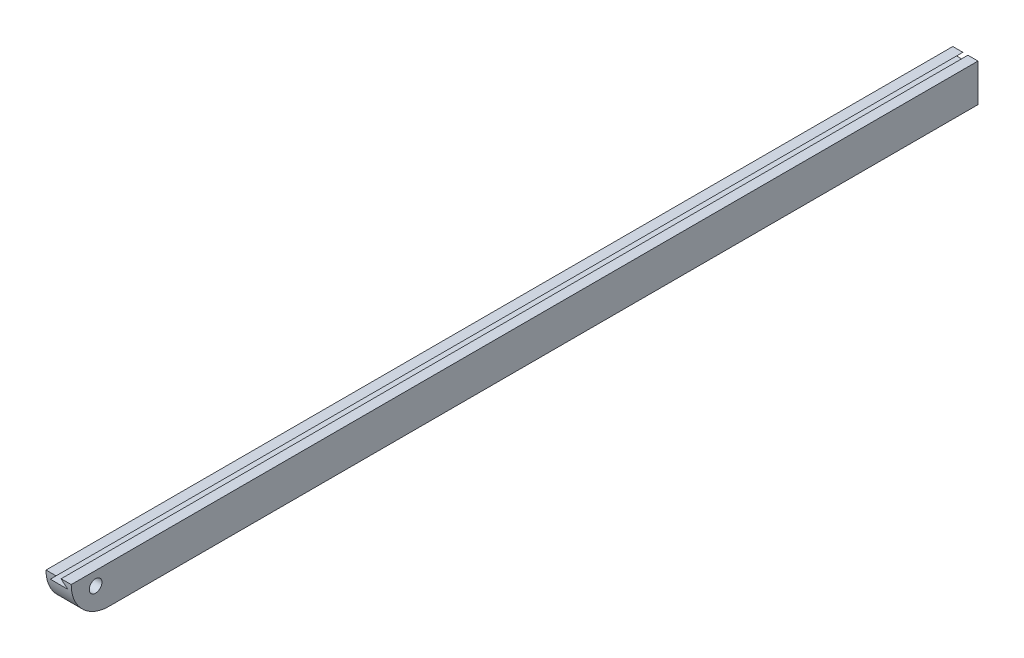
ISO-10303-21;
HEADER;
FILE_DESCRIPTION(('STEP AP214'),'2;1');
FILE_NAME('part.step','',(''),(''),'','','');
FILE_SCHEMA(('AUTOMOTIVE_DESIGN { 1 0 10303 214 1 1 1 1 }'));
ENDSEC;
DATA;
#1=APPLICATION_CONTEXT('core data for automotive mechanical design processes');
#2=APPLICATION_PROTOCOL_DEFINITION('international standard','automotive_design',2000,#1);
#3=PRODUCT_CONTEXT('',#1,'mechanical');
#4=PRODUCT('Part','Part','',(#3));
#5=PRODUCT_RELATED_PRODUCT_CATEGORY('part','',(#4));
#6=PRODUCT_DEFINITION_FORMATION('','',#4);
#7=PRODUCT_DEFINITION_CONTEXT('part definition',#1,'design');
#8=PRODUCT_DEFINITION('design','',#6,#7);
#9=PRODUCT_DEFINITION_SHAPE('','',#8);
#10=(LENGTH_UNIT() NAMED_UNIT(*) SI_UNIT(.MILLI.,.METRE.));
#11=(NAMED_UNIT(*) PLANE_ANGLE_UNIT() SI_UNIT($,.RADIAN.));
#12=(NAMED_UNIT(*) SI_UNIT($,.STERADIAN.) SOLID_ANGLE_UNIT());
#13=UNCERTAINTY_MEASURE_WITH_UNIT(LENGTH_MEASURE(1.E-05),#10,'distance_accuracy_value','');
#14=(GEOMETRIC_REPRESENTATION_CONTEXT(3) GLOBAL_UNCERTAINTY_ASSIGNED_CONTEXT((#13)) GLOBAL_UNIT_ASSIGNED_CONTEXT((#10,
#11,#12)) REPRESENTATION_CONTEXT('',''));
#15=CARTESIAN_POINT('',(0.,0.,0.));
#16=DIRECTION('',(0.,0.,1.));
#17=DIRECTION('',(1.,0.,0.));
#18=AXIS2_PLACEMENT_3D('',#15,#16,#17);
#19=CARTESIAN_POINT('',(0.,0.,457.2));
#20=DIRECTION('',(1.,0.,0.));
#21=DIRECTION('',(0.,1.,0.));
#22=AXIS2_PLACEMENT_3D('',#19,#20,#21);
#23=PLANE('',#22);
#24=CARTESIAN_POINT('',(0.,-6.73519209080186,444.885192090802));
#25=DIRECTION('',(1.,0.,0.));
#26=DIRECTION('',(0.,1.,0.));
#27=AXIS2_PLACEMENT_3D('',#24,#25,#26);
#28=CIRCLE('',#27,3.17499999999997);
#29=CARTESIAN_POINT('',(0.,-3.56019209080189,444.885192090802));
#30=VERTEX_POINT('',#29);
#31=EDGE_CURVE('E177',#30,#30,#28,.T.);
#32=ORIENTED_EDGE('',*,*,#31,.T.);
#33=EDGE_LOOP('',(#32));
#34=FACE_BOUND('',#33,.T.);
#35=DIRECTION('',(0.,0.,-1.));
#36=VECTOR('',#35,1.);
#37=CARTESIAN_POINT('',(0.,-19.05,457.2));
#38=LINE('',#37,#36);
#39=CARTESIAN_POINT('',(0.,-19.05,438.15));
#40=VERTEX_POINT('',#39);
#41=CARTESIAN_POINT('',(0.,-19.05,0.));
#42=VERTEX_POINT('',#41);
#43=EDGE_CURVE('E11',#40,#42,#38,.T.);
#44=ORIENTED_EDGE('',*,*,#43,.F.);
#45=CARTESIAN_POINT('',(0.,0.,438.15));
#46=DIRECTION('',(-1.,0.,0.));
#47=DIRECTION('',(0.,1.,0.));
#48=AXIS2_PLACEMENT_3D('',#45,#46,#47);
#49=CIRCLE('',#48,19.05);
#50=CARTESIAN_POINT('',(0.,0.,457.2));
#51=VERTEX_POINT('',#50);
#52=EDGE_CURVE('E171',#40,#51,#49,.T.);
#53=ORIENTED_EDGE('',*,*,#52,.T.);
#54=DIRECTION('',(0.,0.,-1.));
#55=VECTOR('',#54,1.);
#56=CARTESIAN_POINT('',(0.,0.,457.2));
#57=LINE('',#56,#55);
#58=CARTESIAN_POINT('',(0.,0.,0.));
#59=VERTEX_POINT('',#58);
#60=EDGE_CURVE('E96',#51,#59,#57,.T.);
#61=ORIENTED_EDGE('',*,*,#60,.T.);
#62=DIRECTION('',(0.,-1.,0.));
#63=VECTOR('',#62,1.);
#64=CARTESIAN_POINT('',(0.,0.,0.));
#65=LINE('',#64,#63);
#66=EDGE_CURVE('E102',#59,#42,#65,.T.);
#67=ORIENTED_EDGE('',*,*,#66,.T.);
#68=EDGE_LOOP('',(#44,#53,#61,#67));
#69=FACE_BOUND('',#68,.T.);
#70=ADVANCED_FACE('F35',(#34,#69),#23,.F.);
#71=CARTESIAN_POINT('',(0.,-19.05,457.2));
#72=DIRECTION('',(0.,1.,0.));
#73=DIRECTION('',(0.,0.,1.));
#74=AXIS2_PLACEMENT_3D('',#71,#72,#73);
#75=PLANE('',#74);
#76=DIRECTION('',(0.,0.,-1.));
#77=VECTOR('',#76,1.);
#78=CARTESIAN_POINT('',(12.7,-19.05,457.2));
#79=LINE('',#78,#77);
#80=CARTESIAN_POINT('',(12.7,-19.05,438.15));
#81=VERTEX_POINT('',#80);
#82=CARTESIAN_POINT('',(12.7,-19.05,0.));
#83=VERTEX_POINT('',#82);
#84=EDGE_CURVE('E43',#81,#83,#79,.T.);
#85=ORIENTED_EDGE('',*,*,#84,.F.);
#86=DIRECTION('',(1.,0.,0.));
#87=VECTOR('',#86,1.);
#88=CARTESIAN_POINT('',(0.,-19.05,438.15));
#89=LINE('',#88,#87);
#90=EDGE_CURVE('E174',#40,#81,#89,.T.);
#91=ORIENTED_EDGE('',*,*,#90,.F.);
#92=ORIENTED_EDGE('',*,*,#43,.T.);
#93=DIRECTION('',(1.,0.,0.));
#94=VECTOR('',#93,1.);
#95=CARTESIAN_POINT('',(0.,-19.05,0.));
#96=LINE('',#95,#94);
#97=EDGE_CURVE('E131',#42,#83,#96,.T.);
#98=ORIENTED_EDGE('',*,*,#97,.T.);
#99=EDGE_LOOP('',(#85,#91,#92,#98));
#100=FACE_BOUND('',#99,.T.);
#101=ADVANCED_FACE('F132',(#100),#75,.F.);
#102=CARTESIAN_POINT('',(12.7,0.,457.2));
#103=DIRECTION('',(-1.,0.,0.));
#104=DIRECTION('',(0.,-1.,0.));
#105=AXIS2_PLACEMENT_3D('',#102,#103,#104);
#106=PLANE('',#105);
#107=CARTESIAN_POINT('',(12.7,-6.73519209080186,444.885192090802));
#108=DIRECTION('',(1.,0.,0.));
#109=DIRECTION('',(0.,1.,0.));
#110=AXIS2_PLACEMENT_3D('',#107,#108,#109);
#111=CIRCLE('',#110,3.17499999999997);
#112=CARTESIAN_POINT('',(12.7,-3.56019209080189,444.885192090802));
#113=VERTEX_POINT('',#112);
#114=EDGE_CURVE('E180',#113,#113,#111,.T.);
#115=ORIENTED_EDGE('',*,*,#114,.F.);
#116=EDGE_LOOP('',(#115));
#117=FACE_BOUND('',#116,.T.);
#118=DIRECTION('',(0.,0.,-1.));
#119=VECTOR('',#118,1.);
#120=CARTESIAN_POINT('',(12.7,0.,457.2));
#121=LINE('',#120,#119);
#122=CARTESIAN_POINT('',(12.7,0.,457.2));
#123=VERTEX_POINT('',#122);
#124=CARTESIAN_POINT('',(12.7,0.,0.));
#125=VERTEX_POINT('',#124);
#126=EDGE_CURVE('E116',#123,#125,#121,.T.);
#127=ORIENTED_EDGE('',*,*,#126,.F.);
#128=CARTESIAN_POINT('',(12.7,0.,438.15));
#129=DIRECTION('',(-1.,0.,0.));
#130=DIRECTION('',(0.,1.,0.));
#131=AXIS2_PLACEMENT_3D('',#128,#129,#130);
#132=CIRCLE('',#131,19.05);
#133=EDGE_CURVE('E128',#81,#123,#132,.T.);
#134=ORIENTED_EDGE('',*,*,#133,.F.);
#135=ORIENTED_EDGE('',*,*,#84,.T.);
#136=DIRECTION('',(0.,1.,0.));
#137=VECTOR('',#136,1.);
#138=CARTESIAN_POINT('',(12.7,0.,0.));
#139=LINE('',#138,#137);
#140=EDGE_CURVE('E125',#83,#125,#139,.T.);
#141=ORIENTED_EDGE('',*,*,#140,.T.);
#142=EDGE_LOOP('',(#127,#134,#135,#141));
#143=FACE_BOUND('',#142,.T.);
#144=ADVANCED_FACE('F123',(#117,#143),#106,.F.);
#145=CARTESIAN_POINT('',(7.61999999999996,0.,457.2));
#146=DIRECTION('',(0.,-1.,0.));
#147=DIRECTION('',(1.,0.,0.));
#148=AXIS2_PLACEMENT_3D('',#145,#146,#147);
#149=PLANE('',#148);
#150=DIRECTION('',(-1.,0.,0.));
#151=VECTOR('',#150,1.);
#152=CARTESIAN_POINT('',(7.61999999999996,0.,0.));
#153=LINE('',#152,#151);
#154=CARTESIAN_POINT('',(7.61999999999996,0.,0.));
#155=VERTEX_POINT('',#154);
#156=EDGE_CURVE('E137',#125,#155,#153,.T.);
#157=ORIENTED_EDGE('',*,*,#156,.T.);
#158=DIRECTION('',(0.,0.,-1.));
#159=VECTOR('',#158,1.);
#160=CARTESIAN_POINT('',(7.61999999999996,0.,457.2));
#161=LINE('',#160,#159);
#162=CARTESIAN_POINT('',(7.61999999999996,0.,457.2));
#163=VERTEX_POINT('',#162);
#164=EDGE_CURVE('E113',#163,#155,#161,.T.);
#165=ORIENTED_EDGE('',*,*,#164,.F.);
#166=DIRECTION('',(-1.,0.,0.));
#167=VECTOR('',#166,1.);
#168=CARTESIAN_POINT('',(7.61999999999996,0.,457.2));
#169=LINE('',#168,#167);
#170=EDGE_CURVE('E103',#123,#163,#169,.T.);
#171=ORIENTED_EDGE('',*,*,#170,.F.);
#172=ORIENTED_EDGE('',*,*,#126,.T.);
#173=EDGE_LOOP('',(#157,#165,#171,#172));
#174=FACE_BOUND('',#173,.T.);
#175=ADVANCED_FACE('F158',(#174),#149,.F.);
#176=CARTESIAN_POINT('',(10.795,-3.175,457.2));
#177=DIRECTION('',(0.707106781186544,0.707106781186551,0.));
#178=DIRECTION('',(-0.707106781186551,0.707106781186544,0.));
#179=AXIS2_PLACEMENT_3D('',#176,#177,#178);
#180=PLANE('',#179);
#181=DIRECTION('',(0.,0.,-1.));
#182=VECTOR('',#181,1.);
#183=CARTESIAN_POINT('',(10.795,-3.175,457.2));
#184=LINE('',#183,#182);
#185=CARTESIAN_POINT('',(10.795,-3.175,456.933553311341));
#186=VERTEX_POINT('',#185);
#187=CARTESIAN_POINT('',(10.795,-3.175,0.));
#188=VERTEX_POINT('',#187);
#189=EDGE_CURVE('E111',#186,#188,#184,.T.);
#190=ORIENTED_EDGE('',*,*,#189,.F.);
#191=CARTESIAN_POINT('',(7.61999999999996,0.,438.15));
#192=DIRECTION('',(0.707106781186544,0.707106781186551,0.));
#193=DIRECTION('',(0.707106781186551,-0.707106781186544,0.));
#194=AXIS2_PLACEMENT_3D('',#191,#192,#193);
#195=ELLIPSE('',#194,26.9407683632076,19.05);
#196=EDGE_CURVE('E155',#186,#163,#195,.F.);
#197=ORIENTED_EDGE('',*,*,#196,.T.);
#198=ORIENTED_EDGE('',*,*,#164,.T.);
#199=DIRECTION('',(0.707106781186551,-0.707106781186544,0.));
#200=VECTOR('',#199,1.);
#201=CARTESIAN_POINT('',(10.795,-3.175,0.));
#202=LINE('',#201,#200);
#203=EDGE_CURVE('E139',#155,#188,#202,.T.);
#204=ORIENTED_EDGE('',*,*,#203,.T.);
#205=EDGE_LOOP('',(#190,#197,#198,#204));
#206=FACE_BOUND('',#205,.T.);
#207=ADVANCED_FACE('F150',(#206),#180,.F.);
#208=CARTESIAN_POINT('',(1.905,-3.175,457.2));
#209=DIRECTION('',(0.,-1.,0.));
#210=DIRECTION('',(0.,0.,-1.));
#211=AXIS2_PLACEMENT_3D('',#208,#209,#210);
#212=PLANE('',#211);
#213=DIRECTION('',(0.,0.,-1.));
#214=VECTOR('',#213,1.);
#215=CARTESIAN_POINT('',(1.905,-3.175,457.2));
#216=LINE('',#215,#214);
#217=CARTESIAN_POINT('',(1.905,-3.175,456.933553311341));
#218=VERTEX_POINT('',#217);
#219=CARTESIAN_POINT('',(1.905,-3.175,0.));
#220=VERTEX_POINT('',#219);
#221=EDGE_CURVE('E83',#218,#220,#216,.T.);
#222=ORIENTED_EDGE('',*,*,#221,.F.);
#223=DIRECTION('',(1.,0.,0.));
#224=VECTOR('',#223,1.);
#225=CARTESIAN_POINT('',(0.,-3.175,456.933553311341));
#226=LINE('',#225,#224);
#227=EDGE_CURVE('E184',#218,#186,#226,.T.);
#228=ORIENTED_EDGE('',*,*,#227,.T.);
#229=ORIENTED_EDGE('',*,*,#189,.T.);
#230=DIRECTION('',(-1.,0.,0.));
#231=VECTOR('',#230,1.);
#232=CARTESIAN_POINT('',(1.905,-3.175,0.));
#233=LINE('',#232,#231);
#234=EDGE_CURVE('E89',#188,#220,#233,.T.);
#235=ORIENTED_EDGE('',*,*,#234,.T.);
#236=EDGE_LOOP('',(#222,#228,#229,#235));
#237=FACE_BOUND('',#236,.T.);
#238=ADVANCED_FACE('F145',(#237),#212,.F.);
#239=CARTESIAN_POINT('',(5.08000000000003,0.,457.2));
#240=DIRECTION('',(-0.707106781186544,0.707106781186551,0.));
#241=DIRECTION('',(-0.707106781186551,-0.707106781186544,0.));
#242=AXIS2_PLACEMENT_3D('',#239,#240,#241);
#243=PLANE('',#242);
#244=DIRECTION('',(0.,0.,-1.));
#245=VECTOR('',#244,1.);
#246=CARTESIAN_POINT('',(5.08000000000003,0.,457.2));
#247=LINE('',#246,#245);
#248=CARTESIAN_POINT('',(5.08000000000003,0.,457.2));
#249=VERTEX_POINT('',#248);
#250=CARTESIAN_POINT('',(5.08000000000003,0.,0.));
#251=VERTEX_POINT('',#250);
#252=EDGE_CURVE('E80',#249,#251,#247,.T.);
#253=ORIENTED_EDGE('',*,*,#252,.F.);
#254=CARTESIAN_POINT('',(5.08000000000003,0.,438.15));
#255=DIRECTION('',(-0.707106781186544,0.707106781186551,0.));
#256=DIRECTION('',(0.707106781186551,0.707106781186544,0.));
#257=AXIS2_PLACEMENT_3D('',#254,#255,#256);
#258=ELLIPSE('',#257,26.9407683632076,19.05);
#259=EDGE_CURVE('E50',#249,#218,#258,.F.);
#260=ORIENTED_EDGE('',*,*,#259,.T.);
#261=ORIENTED_EDGE('',*,*,#221,.T.);
#262=DIRECTION('',(0.707106781186551,0.707106781186544,0.));
#263=VECTOR('',#262,1.);
#264=CARTESIAN_POINT('',(5.08000000000003,0.,0.));
#265=LINE('',#264,#263);
#266=EDGE_CURVE('E77',#220,#251,#265,.T.);
#267=ORIENTED_EDGE('',*,*,#266,.T.);
#268=EDGE_LOOP('',(#253,#260,#261,#267));
#269=FACE_BOUND('',#268,.T.);
#270=ADVANCED_FACE('F79',(#269),#243,.F.);
#271=CARTESIAN_POINT('',(0.,0.,457.2));
#272=DIRECTION('',(0.,-1.,0.));
#273=DIRECTION('',(0.,0.,-1.));
#274=AXIS2_PLACEMENT_3D('',#271,#272,#273);
#275=PLANE('',#274);
#276=DIRECTION('',(-1.,0.,0.));
#277=VECTOR('',#276,1.);
#278=CARTESIAN_POINT('',(0.,0.,0.));
#279=LINE('',#278,#277);
#280=EDGE_CURVE('E88',#251,#59,#279,.T.);
#281=ORIENTED_EDGE('',*,*,#280,.T.);
#282=ORIENTED_EDGE('',*,*,#60,.F.);
#283=DIRECTION('',(-1.,0.,0.));
#284=VECTOR('',#283,1.);
#285=CARTESIAN_POINT('',(0.,0.,457.2));
#286=LINE('',#285,#284);
#287=EDGE_CURVE('E95',#249,#51,#286,.T.);
#288=ORIENTED_EDGE('',*,*,#287,.F.);
#289=ORIENTED_EDGE('',*,*,#252,.T.);
#290=EDGE_LOOP('',(#281,#282,#288,#289));
#291=FACE_BOUND('',#290,.T.);
#292=ADVANCED_FACE('F92',(#291),#275,.F.);
#293=CARTESIAN_POINT('',(0.,0.,0.));
#294=DIRECTION('',(0.,0.,1.));
#295=DIRECTION('',(1.,0.,0.));
#296=AXIS2_PLACEMENT_3D('',#293,#294,#295);
#297=PLANE('',#296);
#298=CARTESIAN_POINT('',(6.35,-11.43,0.));
#299=DIRECTION('',(0.,0.,-1.));
#300=DIRECTION('',(-1.,0.,0.));
#301=AXIS2_PLACEMENT_3D('',#298,#299,#300);
#302=CIRCLE('',#301,4.445);
#303=CARTESIAN_POINT('',(1.905,-11.43,0.));
#304=VERTEX_POINT('',#303);
#305=EDGE_CURVE('E190',#304,#304,#302,.T.);
#306=ORIENTED_EDGE('',*,*,#305,.F.);
#307=EDGE_LOOP('',(#306));
#308=FACE_BOUND('',#307,.T.);
#309=ORIENTED_EDGE('',*,*,#66,.F.);
#310=ORIENTED_EDGE('',*,*,#280,.F.);
#311=ORIENTED_EDGE('',*,*,#266,.F.);
#312=ORIENTED_EDGE('',*,*,#234,.F.);
#313=ORIENTED_EDGE('',*,*,#203,.F.);
#314=ORIENTED_EDGE('',*,*,#156,.F.);
#315=ORIENTED_EDGE('',*,*,#140,.F.);
#316=ORIENTED_EDGE('',*,*,#97,.F.);
#317=EDGE_LOOP('',(#309,#310,#311,#312,#313,#314,#315,#316));
#318=FACE_BOUND('',#317,.T.);
#319=ADVANCED_FACE('F99',(#308,#318),#297,.F.);
#320=CARTESIAN_POINT('',(0.,0.,438.15));
#321=DIRECTION('',(1.,0.,0.));
#322=DIRECTION('',(0.,1.,0.));
#323=AXIS2_PLACEMENT_3D('',#320,#321,#322);
#324=CYLINDRICAL_SURFACE('',#323,19.05);
#325=ORIENTED_EDGE('',*,*,#227,.F.);
#326=ORIENTED_EDGE('',*,*,#259,.F.);
#327=ORIENTED_EDGE('',*,*,#287,.T.);
#328=ORIENTED_EDGE('',*,*,#52,.F.);
#329=ORIENTED_EDGE('',*,*,#90,.T.);
#330=ORIENTED_EDGE('',*,*,#133,.T.);
#331=ORIENTED_EDGE('',*,*,#170,.T.);
#332=ORIENTED_EDGE('',*,*,#196,.F.);
#333=EDGE_LOOP('',(#325,#326,#327,#328,#329,#330,#331,#332));
#334=FACE_BOUND('',#333,.T.);
#335=ADVANCED_FACE('F170',(#334),#324,.T.);
#336=CARTESIAN_POINT('',(0.,-6.73519209080186,444.885192090802));
#337=DIRECTION('',(1.,0.,0.));
#338=DIRECTION('',(0.,1.,0.));
#339=AXIS2_PLACEMENT_3D('',#336,#337,#338);
#340=CYLINDRICAL_SURFACE('',#339,3.17499999999997);
#341=ORIENTED_EDGE('',*,*,#31,.F.);
#342=EDGE_LOOP('',(#341));
#343=FACE_BOUND('',#342,.T.);
#344=ORIENTED_EDGE('',*,*,#114,.T.);
#345=EDGE_LOOP('',(#344));
#346=FACE_BOUND('',#345,.T.);
#347=ADVANCED_FACE('F201',(#343,#346),#340,.F.);
#348=CARTESIAN_POINT('',(6.35,-11.43,406.4));
#349=DIRECTION('',(0.,0.,-1.));
#350=DIRECTION('',(-1.,0.,0.));
#351=AXIS2_PLACEMENT_3D('',#348,#349,#350);
#352=CYLINDRICAL_SURFACE('',#351,4.445);
#353=CARTESIAN_POINT('',(6.35,-11.43,406.4));
#354=DIRECTION('',(0.,0.,-1.));
#355=DIRECTION('',(-1.,0.,0.));
#356=AXIS2_PLACEMENT_3D('',#353,#354,#355);
#357=CIRCLE('',#356,4.445);
#358=CARTESIAN_POINT('',(1.905,-11.43,406.4));
#359=VERTEX_POINT('',#358);
#360=EDGE_CURVE('E187',#359,#359,#357,.T.);
#361=ORIENTED_EDGE('',*,*,#360,.F.);
#362=EDGE_LOOP('',(#361));
#363=FACE_BOUND('',#362,.T.);
#364=ORIENTED_EDGE('',*,*,#305,.T.);
#365=EDGE_LOOP('',(#364));
#366=FACE_BOUND('',#365,.T.);
#367=ADVANCED_FACE('F198',(#363,#366),#352,.F.);
#368=CARTESIAN_POINT('',(6.35,-11.43,406.4));
#369=DIRECTION('',(0.,0.,-1.));
#370=DIRECTION('',(-1.,0.,0.));
#371=AXIS2_PLACEMENT_3D('',#368,#369,#370);
#372=PLANE('',#371);
#373=ORIENTED_EDGE('',*,*,#360,.T.);
#374=EDGE_LOOP('',(#373));
#375=FACE_BOUND('',#374,.T.);
#376=ADVANCED_FACE('F196',(#375),#372,.T.);
#377=CLOSED_SHELL('',(#70,#101,#144,#175,#207,#238,#270,#292,#319,#335,#347,#367,#376));
#378=MANIFOLD_SOLID_BREP('B2',#377);
#379=ADVANCED_BREP_SHAPE_REPRESENTATION('',(#18,#378),#14);
#380=SHAPE_DEFINITION_REPRESENTATION(#9,#379);
ENDSEC;
END-ISO-10303-21;
